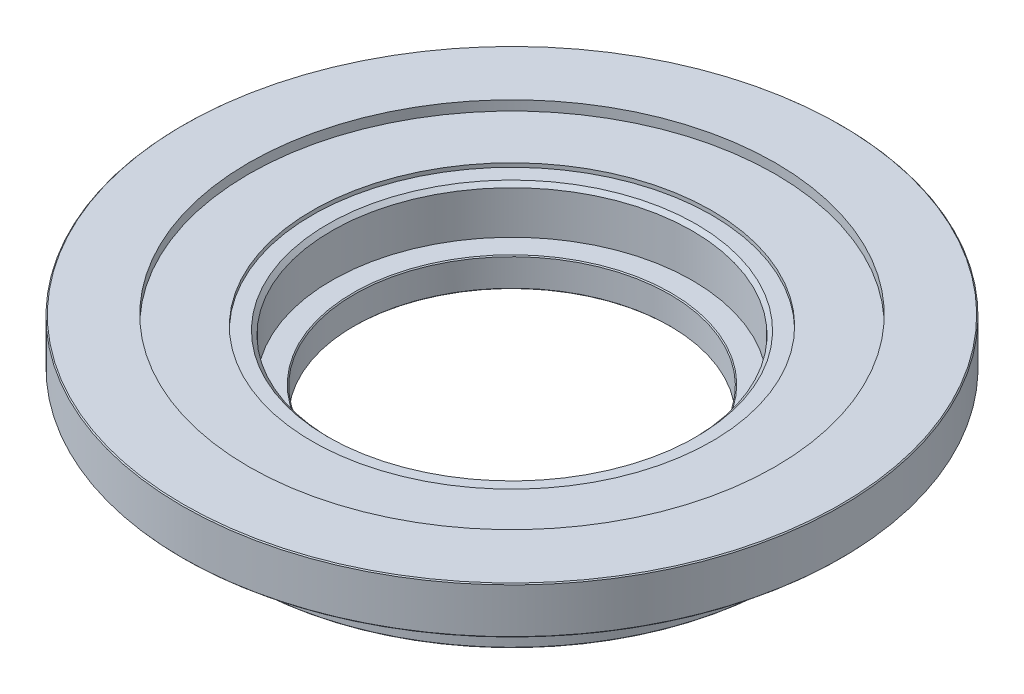
ISO-10303-21;
HEADER;
FILE_DESCRIPTION(('STEP AP214'),'2;1');
FILE_NAME('part.step','',(''),(''),'','','');
FILE_SCHEMA(('AUTOMOTIVE_DESIGN { 1 0 10303 214 1 1 1 1 }'));
ENDSEC;
DATA;
#1=APPLICATION_CONTEXT('core data for automotive mechanical design processes');
#2=APPLICATION_PROTOCOL_DEFINITION('international standard','automotive_design',2000,#1);
#3=PRODUCT_CONTEXT('',#1,'mechanical');
#4=PRODUCT('Part','Part','',(#3));
#5=PRODUCT_RELATED_PRODUCT_CATEGORY('part','',(#4));
#6=PRODUCT_DEFINITION_FORMATION('','',#4);
#7=PRODUCT_DEFINITION_CONTEXT('part definition',#1,'design');
#8=PRODUCT_DEFINITION('design','',#6,#7);
#9=PRODUCT_DEFINITION_SHAPE('','',#8);
#10=(LENGTH_UNIT() NAMED_UNIT(*) SI_UNIT(.MILLI.,.METRE.));
#11=(NAMED_UNIT(*) PLANE_ANGLE_UNIT() SI_UNIT($,.RADIAN.));
#12=(NAMED_UNIT(*) SI_UNIT($,.STERADIAN.) SOLID_ANGLE_UNIT());
#13=UNCERTAINTY_MEASURE_WITH_UNIT(LENGTH_MEASURE(1.E-05),#10,'distance_accuracy_value','');
#14=(GEOMETRIC_REPRESENTATION_CONTEXT(3) GLOBAL_UNCERTAINTY_ASSIGNED_CONTEXT((#13)) GLOBAL_UNIT_ASSIGNED_CONTEXT((#10,
#11,#12)) REPRESENTATION_CONTEXT('',''));
#15=CARTESIAN_POINT('',(0.,0.,0.));
#16=DIRECTION('',(0.,0.,1.));
#17=DIRECTION('',(1.,0.,0.));
#18=AXIS2_PLACEMENT_3D('',#15,#16,#17);
#19=CARTESIAN_POINT('',(0.,56.,0.));
#20=DIRECTION('',(0.,-1.,0.));
#21=DIRECTION('',(0.,0.,-1.));
#22=AXIS2_PLACEMENT_3D('',#19,#20,#21);
#23=CYLINDRICAL_SURFACE('',#22,169.);
#24=CARTESIAN_POINT('',(0.,55.4999999995513,0.));
#25=DIRECTION('',(0.,1.,0.));
#26=DIRECTION('',(0.,0.,1.));
#27=AXIS2_PLACEMENT_3D('',#24,#25,#26);
#28=CIRCLE('',#27,169.);
#29=CARTESIAN_POINT('',(0.,55.4999999995513,169.));
#30=VERTEX_POINT('',#29);
#31=EDGE_CURVE('E84',#30,#30,#28,.F.);
#32=ORIENTED_EDGE('',*,*,#31,.T.);
#33=EDGE_LOOP('',(#32));
#34=FACE_BOUND('',#33,.T.);
#35=CARTESIAN_POINT('',(0.,32.4999999995513,0.));
#36=DIRECTION('',(0.,-1.,0.));
#37=DIRECTION('',(0.,0.,-1.));
#38=AXIS2_PLACEMENT_3D('',#35,#36,#37);
#39=CIRCLE('',#38,169.);
#40=CARTESIAN_POINT('',(0.,32.4999999995513,-169.));
#41=VERTEX_POINT('',#40);
#42=EDGE_CURVE('E87',#41,#41,#39,.F.);
#43=ORIENTED_EDGE('',*,*,#42,.T.);
#44=EDGE_LOOP('',(#43));
#45=FACE_BOUND('',#44,.T.);
#46=ADVANCED_FACE('F39',(#34,#45),#23,.T.);
#47=CARTESIAN_POINT('',(169.,56.,0.));
#48=DIRECTION('',(0.,1.,0.));
#49=DIRECTION('',(0.,0.,1.));
#50=AXIS2_PLACEMENT_3D('',#47,#48,#49);
#51=PLANE('',#50);
#52=CARTESIAN_POINT('',(0.,56.,0.));
#53=DIRECTION('',(0.,1.,0.));
#54=DIRECTION('',(0.,0.,1.));
#55=AXIS2_PLACEMENT_3D('',#52,#53,#54);
#56=CIRCLE('',#55,168.500000000449);
#57=CARTESIAN_POINT('',(0.,56.,168.500000000449));
#58=VERTEX_POINT('',#57);
#59=EDGE_CURVE('E81',#58,#58,#56,.T.);
#60=ORIENTED_EDGE('',*,*,#59,.T.);
#61=EDGE_LOOP('',(#60));
#62=FACE_BOUND('',#61,.T.);
#63=CARTESIAN_POINT('',(0.,56.,0.));
#64=DIRECTION('',(0.,-1.,0.));
#65=DIRECTION('',(0.,0.,-1.));
#66=AXIS2_PLACEMENT_3D('',#63,#64,#65);
#67=CIRCLE('',#66,135.);
#68=CARTESIAN_POINT('',(0.,56.,-135.));
#69=VERTEX_POINT('',#68);
#70=EDGE_CURVE('E93',#69,#69,#67,.T.);
#71=ORIENTED_EDGE('',*,*,#70,.T.);
#72=EDGE_LOOP('',(#71));
#73=FACE_BOUND('',#72,.T.);
#74=ADVANCED_FACE('F137',(#62,#73),#51,.T.);
#75=CARTESIAN_POINT('',(0.,32.,0.));
#76=DIRECTION('',(0.,-1.,0.));
#77=DIRECTION('',(0.,0.,-1.));
#78=AXIS2_PLACEMENT_3D('',#75,#76,#77);
#79=PLANE('',#78);
#80=CARTESIAN_POINT('',(0.,32.,0.));
#81=DIRECTION('',(0.,-1.,0.));
#82=DIRECTION('',(0.,0.,-1.));
#83=AXIS2_PLACEMENT_3D('',#80,#81,#82);
#84=CIRCLE('',#83,168.499999999551);
#85=CARTESIAN_POINT('',(0.,32.,-168.499999999551));
#86=VERTEX_POINT('',#85);
#87=EDGE_CURVE('E60',#86,#86,#84,.T.);
#88=ORIENTED_EDGE('',*,*,#87,.T.);
#89=EDGE_LOOP('',(#88));
#90=FACE_BOUND('',#89,.T.);
#91=CARTESIAN_POINT('',(0.,32.,0.));
#92=DIRECTION('',(0.,-1.,0.));
#93=DIRECTION('',(0.,0.,-1.));
#94=AXIS2_PLACEMENT_3D('',#91,#92,#93);
#95=CIRCLE('',#94,137.5);
#96=CARTESIAN_POINT('',(0.,32.,-137.5));
#97=VERTEX_POINT('',#96);
#98=EDGE_CURVE('E90',#97,#97,#95,.T.);
#99=ORIENTED_EDGE('',*,*,#98,.F.);
#100=EDGE_LOOP('',(#99));
#101=FACE_BOUND('',#100,.T.);
#102=ADVANCED_FACE('F143',(#90,#101),#79,.T.);
#103=CARTESIAN_POINT('',(0.,5.,0.));
#104=DIRECTION('',(0.,1.,0.));
#105=DIRECTION('',(0.,0.,1.));
#106=AXIS2_PLACEMENT_3D('',#103,#104,#105);
#107=CYLINDRICAL_SURFACE('',#106,137.5);
#108=CARTESIAN_POINT('',(0.,5.49999999955117,0.));
#109=DIRECTION('',(0.,-1.,0.));
#110=DIRECTION('',(0.,0.,-1.));
#111=AXIS2_PLACEMENT_3D('',#108,#109,#110);
#112=CIRCLE('',#111,137.5);
#113=CARTESIAN_POINT('',(0.,5.49999999955117,-137.5));
#114=VERTEX_POINT('',#113);
#115=EDGE_CURVE('E51',#114,#114,#112,.F.);
#116=ORIENTED_EDGE('',*,*,#115,.T.);
#117=EDGE_LOOP('',(#116));
#118=FACE_BOUND('',#117,.T.);
#119=ORIENTED_EDGE('',*,*,#98,.T.);
#120=EDGE_LOOP('',(#119));
#121=FACE_BOUND('',#120,.T.);
#122=ADVANCED_FACE('F198',(#118,#121),#107,.T.);
#123=CARTESIAN_POINT('',(0.,5.,0.));
#124=DIRECTION('',(0.,-1.,0.));
#125=DIRECTION('',(0.,0.,-1.));
#126=AXIS2_PLACEMENT_3D('',#123,#124,#125);
#127=PLANE('',#126);
#128=CARTESIAN_POINT('',(0.,5.,0.));
#129=DIRECTION('',(0.,-1.,0.));
#130=DIRECTION('',(0.,0.,-1.));
#131=AXIS2_PLACEMENT_3D('',#128,#129,#130);
#132=CIRCLE('',#131,132.999999999551);
#133=CARTESIAN_POINT('',(0.,5.,-132.999999999551));
#134=VERTEX_POINT('',#133);
#135=EDGE_CURVE('E72',#134,#134,#132,.F.);
#136=ORIENTED_EDGE('',*,*,#135,.T.);
#137=EDGE_LOOP('',(#136));
#138=FACE_BOUND('',#137,.T.);
#139=CARTESIAN_POINT('',(0.,5.,0.));
#140=DIRECTION('',(0.,-1.,0.));
#141=DIRECTION('',(0.,0.,-1.));
#142=AXIS2_PLACEMENT_3D('',#139,#140,#141);
#143=CIRCLE('',#142,136.999999999551);
#144=CARTESIAN_POINT('',(0.,5.,-136.999999999551));
#145=VERTEX_POINT('',#144);
#146=EDGE_CURVE('E75',#145,#145,#143,.T.);
#147=ORIENTED_EDGE('',*,*,#146,.T.);
#148=EDGE_LOOP('',(#147));
#149=FACE_BOUND('',#148,.T.);
#150=ADVANCED_FACE('F196',(#138,#149),#127,.T.);
#151=CARTESIAN_POINT('',(0.,56.,0.));
#152=DIRECTION('',(0.,-1.,0.));
#153=DIRECTION('',(0.,0.,-1.));
#154=AXIS2_PLACEMENT_3D('',#151,#152,#153);
#155=CYLINDRICAL_SURFACE('',#154,135.);
#156=ORIENTED_EDGE('',*,*,#70,.F.);
#157=EDGE_LOOP('',(#156));
#158=FACE_BOUND('',#157,.T.);
#159=CARTESIAN_POINT('',(0.,51.,0.));
#160=DIRECTION('',(0.,-1.,0.));
#161=DIRECTION('',(0.,0.,-1.));
#162=AXIS2_PLACEMENT_3D('',#159,#160,#161);
#163=CIRCLE('',#162,135.);
#164=CARTESIAN_POINT('',(0.,51.,-135.));
#165=VERTEX_POINT('',#164);
#166=EDGE_CURVE('E108',#165,#165,#163,.T.);
#167=ORIENTED_EDGE('',*,*,#166,.T.);
#168=EDGE_LOOP('',(#167));
#169=FACE_BOUND('',#168,.T.);
#170=ADVANCED_FACE('F112',(#158,#169),#155,.F.);
#171=CARTESIAN_POINT('',(0.,56.,0.));
#172=DIRECTION('',(0.,-1.,0.));
#173=DIRECTION('',(0.,0.,-1.));
#174=AXIS2_PLACEMENT_3D('',#171,#172,#173);
#175=CYLINDRICAL_SURFACE('',#174,132.5);
#176=CARTESIAN_POINT('',(0.,5.50000000044864,0.));
#177=DIRECTION('',(0.,-1.,0.));
#178=DIRECTION('',(0.,0.,-1.));
#179=AXIS2_PLACEMENT_3D('',#176,#177,#178);
#180=CIRCLE('',#179,132.5);
#181=CARTESIAN_POINT('',(0.,5.50000000044864,-132.5));
#182=VERTEX_POINT('',#181);
#183=EDGE_CURVE('E78',#182,#182,#180,.T.);
#184=ORIENTED_EDGE('',*,*,#183,.T.);
#185=EDGE_LOOP('',(#184));
#186=FACE_BOUND('',#185,.T.);
#187=CARTESIAN_POINT('',(0.,10.,0.));
#188=DIRECTION('',(0.,-1.,0.));
#189=DIRECTION('',(0.,0.,-1.));
#190=AXIS2_PLACEMENT_3D('',#187,#188,#189);
#191=CIRCLE('',#190,132.5);
#192=CARTESIAN_POINT('',(0.,10.,-132.5));
#193=VERTEX_POINT('',#192);
#194=EDGE_CURVE('E96',#193,#193,#191,.T.);
#195=ORIENTED_EDGE('',*,*,#194,.F.);
#196=EDGE_LOOP('',(#195));
#197=FACE_BOUND('',#196,.T.);
#198=ADVANCED_FACE('F205',(#186,#197),#175,.F.);
#199=CARTESIAN_POINT('',(132.5,10.,0.));
#200=DIRECTION('',(0.,1.,0.));
#201=DIRECTION('',(0.,0.,1.));
#202=AXIS2_PLACEMENT_3D('',#199,#200,#201);
#203=PLANE('',#202);
#204=CARTESIAN_POINT('',(0.,10.,0.));
#205=DIRECTION('',(0.,1.,0.));
#206=DIRECTION('',(0.,0.,1.));
#207=AXIS2_PLACEMENT_3D('',#204,#205,#206);
#208=CIRCLE('',#207,81.4999999995513);
#209=CARTESIAN_POINT('',(0.,10.,81.4999999995513));
#210=VERTEX_POINT('',#209);
#211=EDGE_CURVE('E55',#210,#210,#208,.T.);
#212=ORIENTED_EDGE('',*,*,#211,.T.);
#213=EDGE_LOOP('',(#212));
#214=FACE_BOUND('',#213,.T.);
#215=ORIENTED_EDGE('',*,*,#194,.T.);
#216=EDGE_LOOP('',(#215));
#217=FACE_BOUND('',#216,.T.);
#218=ADVANCED_FACE('F240',(#214,#217),#203,.F.);
#219=CARTESIAN_POINT('',(0.,56.,0.));
#220=DIRECTION('',(0.,-1.,0.));
#221=DIRECTION('',(0.,0.,-1.));
#222=AXIS2_PLACEMENT_3D('',#219,#220,#221);
#223=CYLINDRICAL_SURFACE('',#222,81.);
#224=CARTESIAN_POINT('',(0.,24.5000000004488,0.));
#225=DIRECTION('',(0.,-1.,0.));
#226=DIRECTION('',(0.,0.,-1.));
#227=AXIS2_PLACEMENT_3D('',#224,#225,#226);
#228=CIRCLE('',#227,81.);
#229=CARTESIAN_POINT('',(0.,24.5000000004488,-81.));
#230=VERTEX_POINT('',#229);
#231=EDGE_CURVE('E63',#230,#230,#228,.F.);
#232=ORIENTED_EDGE('',*,*,#231,.T.);
#233=EDGE_LOOP('',(#232));
#234=FACE_BOUND('',#233,.T.);
#235=CARTESIAN_POINT('',(0.,10.5000000004487,0.));
#236=DIRECTION('',(0.,1.,0.));
#237=DIRECTION('',(0.,0.,1.));
#238=AXIS2_PLACEMENT_3D('',#235,#236,#237);
#239=CIRCLE('',#238,81.);
#240=CARTESIAN_POINT('',(0.,10.5000000004487,81.));
#241=VERTEX_POINT('',#240);
#242=EDGE_CURVE('E66',#241,#241,#239,.F.);
#243=ORIENTED_EDGE('',*,*,#242,.T.);
#244=EDGE_LOOP('',(#243));
#245=FACE_BOUND('',#244,.T.);
#246=ADVANCED_FACE('F249',(#234,#245),#223,.F.);
#247=CARTESIAN_POINT('',(81.,25.,0.));
#248=DIRECTION('',(0.,-1.,0.));
#249=DIRECTION('',(0.,0.,-1.));
#250=AXIS2_PLACEMENT_3D('',#247,#248,#249);
#251=PLANE('',#250);
#252=CARTESIAN_POINT('',(0.,25.,0.));
#253=DIRECTION('',(0.,-1.,0.));
#254=DIRECTION('',(0.,0.,-1.));
#255=AXIS2_PLACEMENT_3D('',#252,#253,#254);
#256=CIRCLE('',#255,81.5000000004487);
#257=CARTESIAN_POINT('',(0.,25.,-81.5000000004487));
#258=VERTEX_POINT('',#257);
#259=EDGE_CURVE('E69',#258,#258,#256,.T.);
#260=ORIENTED_EDGE('',*,*,#259,.T.);
#261=EDGE_LOOP('',(#260));
#262=FACE_BOUND('',#261,.T.);
#263=CARTESIAN_POINT('',(0.,25.,0.));
#264=DIRECTION('',(0.,-1.,0.));
#265=DIRECTION('',(0.,0.,-1.));
#266=AXIS2_PLACEMENT_3D('',#263,#264,#265);
#267=CIRCLE('',#266,92.5);
#268=CARTESIAN_POINT('',(0.,25.,-92.5));
#269=VERTEX_POINT('',#268);
#270=EDGE_CURVE('E99',#269,#269,#267,.T.);
#271=ORIENTED_EDGE('',*,*,#270,.F.);
#272=EDGE_LOOP('',(#271));
#273=FACE_BOUND('',#272,.T.);
#274=ADVANCED_FACE('F134',(#262,#273),#251,.F.);
#275=CARTESIAN_POINT('',(0.,56.,0.));
#276=DIRECTION('',(0.,-1.,0.));
#277=DIRECTION('',(0.,0.,-1.));
#278=AXIS2_PLACEMENT_3D('',#275,#276,#277);
#279=CYLINDRICAL_SURFACE('',#278,92.5);
#280=CARTESIAN_POINT('',(0.,47.0000000017949,0.));
#281=DIRECTION('',(0.,-1.,0.));
#282=DIRECTION('',(0.,0.,-1.));
#283=AXIS2_PLACEMENT_3D('',#280,#281,#282);
#284=CIRCLE('',#283,92.5);
#285=CARTESIAN_POINT('',(0.,47.0000000017949,-92.5));
#286=VERTEX_POINT('',#285);
#287=EDGE_CURVE('E10',#286,#286,#284,.F.);
#288=ORIENTED_EDGE('',*,*,#287,.T.);
#289=EDGE_LOOP('',(#288));
#290=FACE_BOUND('',#289,.T.);
#291=ORIENTED_EDGE('',*,*,#270,.T.);
#292=EDGE_LOOP('',(#291));
#293=FACE_BOUND('',#292,.T.);
#294=ADVANCED_FACE('F129',(#290,#293),#279,.F.);
#295=CARTESIAN_POINT('',(92.5,49.,0.));
#296=DIRECTION('',(0.,-1.,0.));
#297=DIRECTION('',(0.,0.,-1.));
#298=AXIS2_PLACEMENT_3D('',#295,#296,#297);
#299=PLANE('',#298);
#300=CARTESIAN_POINT('',(0.,49.,0.));
#301=DIRECTION('',(0.,-1.,0.));
#302=DIRECTION('',(0.,0.,-1.));
#303=AXIS2_PLACEMENT_3D('',#300,#301,#302);
#304=CIRCLE('',#303,94.5000000017949);
#305=CARTESIAN_POINT('',(0.,49.,-94.5000000017949));
#306=VERTEX_POINT('',#305);
#307=EDGE_CURVE('E47',#306,#306,#304,.T.);
#308=ORIENTED_EDGE('',*,*,#307,.T.);
#309=EDGE_LOOP('',(#308));
#310=FACE_BOUND('',#309,.T.);
#311=CARTESIAN_POINT('',(0.,49.,0.));
#312=DIRECTION('',(0.,-1.,0.));
#313=DIRECTION('',(0.,0.,-1.));
#314=AXIS2_PLACEMENT_3D('',#311,#312,#313);
#315=CIRCLE('',#314,102.5);
#316=CARTESIAN_POINT('',(0.,49.,-102.5));
#317=VERTEX_POINT('',#316);
#318=EDGE_CURVE('E102',#317,#317,#315,.T.);
#319=ORIENTED_EDGE('',*,*,#318,.F.);
#320=EDGE_LOOP('',(#319));
#321=FACE_BOUND('',#320,.T.);
#322=ADVANCED_FACE('F124',(#310,#321),#299,.F.);
#323=CARTESIAN_POINT('',(0.,56.,0.));
#324=DIRECTION('',(0.,-1.,0.));
#325=DIRECTION('',(0.,0.,-1.));
#326=AXIS2_PLACEMENT_3D('',#323,#324,#325);
#327=CYLINDRICAL_SURFACE('',#326,102.5);
#328=CARTESIAN_POINT('',(0.,51.,0.));
#329=DIRECTION('',(0.,-1.,0.));
#330=DIRECTION('',(0.,0.,-1.));
#331=AXIS2_PLACEMENT_3D('',#328,#329,#330);
#332=CIRCLE('',#331,102.5);
#333=CARTESIAN_POINT('',(0.,51.,-102.5));
#334=VERTEX_POINT('',#333);
#335=EDGE_CURVE('E105',#334,#334,#332,.T.);
#336=ORIENTED_EDGE('',*,*,#335,.F.);
#337=EDGE_LOOP('',(#336));
#338=FACE_BOUND('',#337,.T.);
#339=ORIENTED_EDGE('',*,*,#318,.T.);
#340=EDGE_LOOP('',(#339));
#341=FACE_BOUND('',#340,.T.);
#342=ADVANCED_FACE('F118',(#338,#341),#327,.F.);
#343=CARTESIAN_POINT('',(102.5,51.,0.));
#344=DIRECTION('',(0.,-1.,0.));
#345=DIRECTION('',(0.,0.,-1.));
#346=AXIS2_PLACEMENT_3D('',#343,#344,#345);
#347=PLANE('',#346);
#348=ORIENTED_EDGE('',*,*,#166,.F.);
#349=EDGE_LOOP('',(#348));
#350=FACE_BOUND('',#349,.T.);
#351=ORIENTED_EDGE('',*,*,#335,.T.);
#352=EDGE_LOOP('',(#351));
#353=FACE_BOUND('',#352,.T.);
#354=ADVANCED_FACE('F114',(#350,#353),#347,.F.);
#355=CARTESIAN_POINT('',(0.,55.4999999995513,0.));
#356=DIRECTION('',(0.,-1.,0.));
#357=DIRECTION('',(0.,0.,-1.));
#358=AXIS2_PLACEMENT_3D('',#355,#356,#357);
#359=CONICAL_SURFACE('',#358,169.,0.785398162499972);
#360=ORIENTED_EDGE('',*,*,#59,.F.);
#361=EDGE_LOOP('',(#360));
#362=FACE_BOUND('',#361,.T.);
#363=ORIENTED_EDGE('',*,*,#31,.F.);
#364=EDGE_LOOP('',(#363));
#365=FACE_BOUND('',#364,.T.);
#366=ADVANCED_FACE('F117',(#362,#365),#359,.T.);
#367=CARTESIAN_POINT('',(0.,5.50000000044864,0.));
#368=DIRECTION('',(0.,-1.,0.));
#369=DIRECTION('',(0.,0.,-1.));
#370=AXIS2_PLACEMENT_3D('',#367,#368,#369);
#371=CONICAL_SURFACE('',#370,132.5,0.785398162500055);
#372=ORIENTED_EDGE('',*,*,#135,.F.);
#373=EDGE_LOOP('',(#372));
#374=FACE_BOUND('',#373,.T.);
#375=ORIENTED_EDGE('',*,*,#183,.F.);
#376=EDGE_LOOP('',(#375));
#377=FACE_BOUND('',#376,.T.);
#378=ADVANCED_FACE('F155',(#374,#377),#371,.F.);
#379=CARTESIAN_POINT('',(0.,25.,0.));
#380=DIRECTION('',(0.,1.,0.));
#381=DIRECTION('',(0.,0.,1.));
#382=AXIS2_PLACEMENT_3D('',#379,#380,#381);
#383=CONICAL_SURFACE('',#382,81.5000000004487,0.785398164294911);
#384=ORIENTED_EDGE('',*,*,#231,.F.);
#385=EDGE_LOOP('',(#384));
#386=FACE_BOUND('',#385,.T.);
#387=ORIENTED_EDGE('',*,*,#259,.F.);
#388=EDGE_LOOP('',(#387));
#389=FACE_BOUND('',#388,.T.);
#390=ADVANCED_FACE('F162',(#386,#389),#383,.F.);
#391=CARTESIAN_POINT('',(0.,32.,0.));
#392=DIRECTION('',(0.,1.,0.));
#393=DIRECTION('',(0.,0.,1.));
#394=AXIS2_PLACEMENT_3D('',#391,#392,#393);
#395=CONICAL_SURFACE('',#394,168.499999999551,0.78539816429498);
#396=ORIENTED_EDGE('',*,*,#42,.F.);
#397=EDGE_LOOP('',(#396));
#398=FACE_BOUND('',#397,.T.);
#399=ORIENTED_EDGE('',*,*,#87,.F.);
#400=EDGE_LOOP('',(#399));
#401=FACE_BOUND('',#400,.T.);
#402=ADVANCED_FACE('F169',(#398,#401),#395,.T.);
#403=CARTESIAN_POINT('',(0.,10.5000000004487,0.));
#404=DIRECTION('',(0.,-1.,0.));
#405=DIRECTION('',(0.,0.,-1.));
#406=AXIS2_PLACEMENT_3D('',#403,#404,#405);
#407=CONICAL_SURFACE('',#406,81.,0.785398162500041);
#408=ORIENTED_EDGE('',*,*,#211,.F.);
#409=EDGE_LOOP('',(#408));
#410=FACE_BOUND('',#409,.T.);
#411=ORIENTED_EDGE('',*,*,#242,.F.);
#412=EDGE_LOOP('',(#411));
#413=FACE_BOUND('',#412,.T.);
#414=ADVANCED_FACE('F176',(#410,#413),#407,.F.);
#415=CARTESIAN_POINT('',(0.,5.,0.));
#416=DIRECTION('',(0.,1.,0.));
#417=DIRECTION('',(0.,0.,1.));
#418=AXIS2_PLACEMENT_3D('',#415,#416,#417);
#419=CONICAL_SURFACE('',#418,136.999999999551,0.78539816429498);
#420=ORIENTED_EDGE('',*,*,#115,.F.);
#421=EDGE_LOOP('',(#420));
#422=FACE_BOUND('',#421,.T.);
#423=ORIENTED_EDGE('',*,*,#146,.F.);
#424=EDGE_LOOP('',(#423));
#425=FACE_BOUND('',#424,.T.);
#426=ADVANCED_FACE('F182',(#422,#425),#419,.T.);
#427=CARTESIAN_POINT('',(0.,49.,0.));
#428=DIRECTION('',(0.,1.,0.));
#429=DIRECTION('',(0.,0.,1.));
#430=AXIS2_PLACEMENT_3D('',#427,#428,#429);
#431=CONICAL_SURFACE('',#430,94.5000000017949,0.78539816429489);
#432=ORIENTED_EDGE('',*,*,#287,.F.);
#433=EDGE_LOOP('',(#432));
#434=FACE_BOUND('',#433,.T.);
#435=ORIENTED_EDGE('',*,*,#307,.F.);
#436=EDGE_LOOP('',(#435));
#437=FACE_BOUND('',#436,.T.);
#438=ADVANCED_FACE('F42',(#434,#437),#431,.F.);
#439=CLOSED_SHELL('',(#46,#74,#102,#122,#150,#170,#198,#218,#246,#274,#294,#322,#342,#354,#366,
#378,#390,#402,#414,#426,#438));
#440=MANIFOLD_SOLID_BREP('B2',#439);
#441=ADVANCED_BREP_SHAPE_REPRESENTATION('',(#18,#440),#14);
#442=SHAPE_DEFINITION_REPRESENTATION(#9,#441);
ENDSEC;
END-ISO-10303-21;
